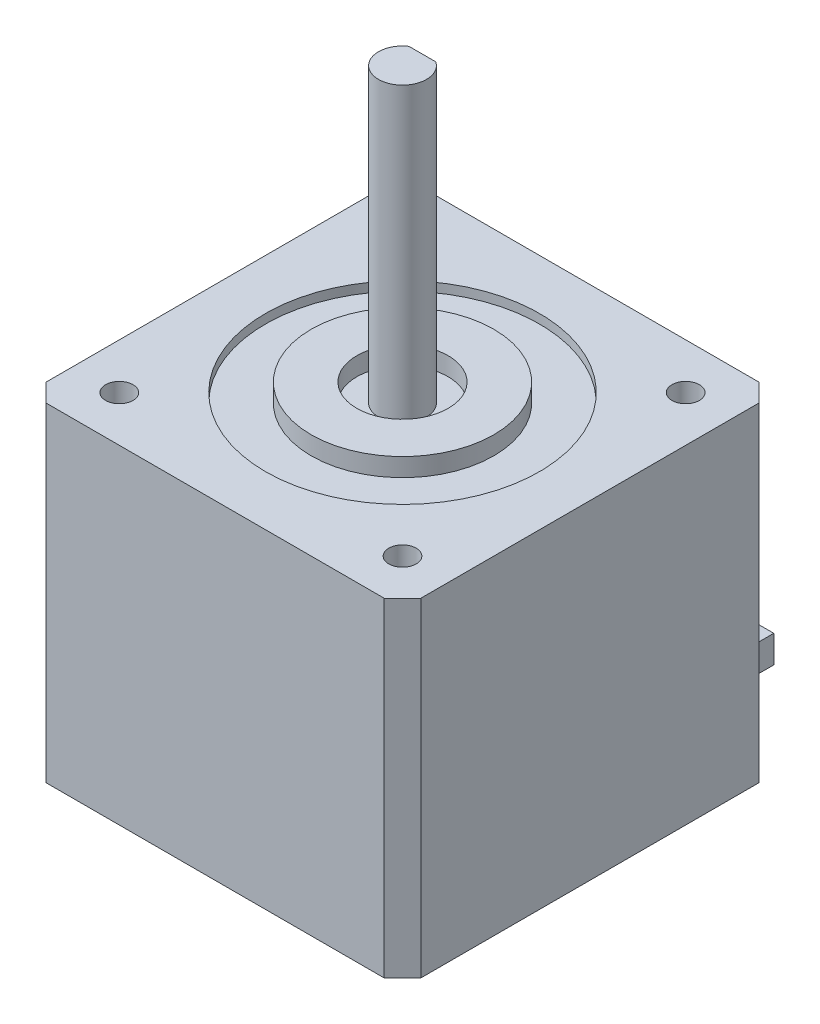
ISO-10303-21;
HEADER;
FILE_DESCRIPTION(('STEP AP214'),'2;1');
FILE_NAME('part.step','',(''),(''),'','','');
FILE_SCHEMA(('AUTOMOTIVE_DESIGN { 1 0 10303 214 1 1 1 1 }'));
ENDSEC;
DATA;
#1=APPLICATION_CONTEXT('core data for automotive mechanical design processes');
#2=APPLICATION_PROTOCOL_DEFINITION('international standard','automotive_design',2000,#1);
#3=PRODUCT_CONTEXT('',#1,'mechanical');
#4=PRODUCT('Part','Part','',(#3));
#5=PRODUCT_RELATED_PRODUCT_CATEGORY('part','',(#4));
#6=PRODUCT_DEFINITION_FORMATION('','',#4);
#7=PRODUCT_DEFINITION_CONTEXT('part definition',#1,'design');
#8=PRODUCT_DEFINITION('design','',#6,#7);
#9=PRODUCT_DEFINITION_SHAPE('','',#8);
#10=(LENGTH_UNIT() NAMED_UNIT(*) SI_UNIT(.MILLI.,.METRE.));
#11=(NAMED_UNIT(*) PLANE_ANGLE_UNIT() SI_UNIT($,.RADIAN.));
#12=(NAMED_UNIT(*) SI_UNIT($,.STERADIAN.) SOLID_ANGLE_UNIT());
#13=UNCERTAINTY_MEASURE_WITH_UNIT(LENGTH_MEASURE(1.E-05),#10,'distance_accuracy_value','');
#14=(GEOMETRIC_REPRESENTATION_CONTEXT(3) GLOBAL_UNCERTAINTY_ASSIGNED_CONTEXT((#13)) GLOBAL_UNIT_ASSIGNED_CONTEXT((#10,
#11,#12)) REPRESENTATION_CONTEXT('',''));
#15=CARTESIAN_POINT('',(0.,0.,0.));
#16=DIRECTION('',(0.,0.,1.));
#17=DIRECTION('',(1.,0.,0.));
#18=AXIS2_PLACEMENT_3D('',#15,#16,#17);
#19=CARTESIAN_POINT('',(-18.5,36.,-20.5));
#20=DIRECTION('',(0.,0.,1.));
#21=DIRECTION('',(1.,0.,0.));
#22=AXIS2_PLACEMENT_3D('',#19,#20,#21);
#23=PLANE('',#22);
#24=DIRECTION('',(0.,-1.,0.));
#25=VECTOR('',#24,1.);
#26=CARTESIAN_POINT('',(10.1415461571168,0.,-20.5));
#27=LINE('',#26,#25);
#28=CARTESIAN_POINT('',(10.1415461571168,3.,-20.5));
#29=VERTEX_POINT('',#28);
#30=CARTESIAN_POINT('',(10.1415461571168,0.,-20.5));
#31=VERTEX_POINT('',#30);
#32=EDGE_CURVE('E57',#29,#31,#27,.T.);
#33=ORIENTED_EDGE('',*,*,#32,.F.);
#34=DIRECTION('',(1.,0.,0.));
#35=VECTOR('',#34,1.);
#36=CARTESIAN_POINT('',(10.1415461571168,3.,-20.5));
#37=LINE('',#36,#35);
#38=CARTESIAN_POINT('',(-9.85845384288318,3.,-20.5));
#39=VERTEX_POINT('',#38);
#40=EDGE_CURVE('E174',#39,#29,#37,.T.);
#41=ORIENTED_EDGE('',*,*,#40,.F.);
#42=DIRECTION('',(0.,1.,0.));
#43=VECTOR('',#42,1.);
#44=CARTESIAN_POINT('',(-9.85845384288318,0.,-20.5));
#45=LINE('',#44,#43);
#46=CARTESIAN_POINT('',(-9.85845384288318,0.,-20.5));
#47=VERTEX_POINT('',#46);
#48=EDGE_CURVE('E63',#47,#39,#45,.T.);
#49=ORIENTED_EDGE('',*,*,#48,.F.);
#50=DIRECTION('',(-1.,0.,0.));
#51=VECTOR('',#50,1.);
#52=CARTESIAN_POINT('',(-18.5,0.,-20.5));
#53=LINE('',#52,#51);
#54=CARTESIAN_POINT('',(-18.5,0.,-20.5));
#55=VERTEX_POINT('',#54);
#56=EDGE_CURVE('E234',#47,#55,#53,.T.);
#57=ORIENTED_EDGE('',*,*,#56,.T.);
#58=DIRECTION('',(0.,-1.,0.));
#59=VECTOR('',#58,1.);
#60=CARTESIAN_POINT('',(-18.5,36.,-20.5));
#61=LINE('',#60,#59);
#62=CARTESIAN_POINT('',(-18.5,36.,-20.5));
#63=VERTEX_POINT('',#62);
#64=EDGE_CURVE('E50',#63,#55,#61,.T.);
#65=ORIENTED_EDGE('',*,*,#64,.F.);
#66=DIRECTION('',(-1.,0.,0.));
#67=VECTOR('',#66,1.);
#68=CARTESIAN_POINT('',(-18.5,36.,-20.5));
#69=LINE('',#68,#67);
#70=CARTESIAN_POINT('',(18.5,36.,-20.5));
#71=VERTEX_POINT('',#70);
#72=EDGE_CURVE('E237',#71,#63,#69,.T.);
#73=ORIENTED_EDGE('',*,*,#72,.F.);
#74=DIRECTION('',(0.,-1.,0.));
#75=VECTOR('',#74,1.);
#76=CARTESIAN_POINT('',(18.5,36.,-20.5));
#77=LINE('',#76,#75);
#78=CARTESIAN_POINT('',(18.5,0.,-20.5));
#79=VERTEX_POINT('',#78);
#80=EDGE_CURVE('E255',#71,#79,#77,.T.);
#81=ORIENTED_EDGE('',*,*,#80,.T.);
#82=EDGE_CURVE('E256',#79,#31,#53,.T.);
#83=ORIENTED_EDGE('',*,*,#82,.T.);
#84=EDGE_LOOP('',(#33,#41,#49,#57,#65,#73,#81,#83));
#85=FACE_BOUND('',#84,.T.);
#86=ADVANCED_FACE('F43',(#85),#23,.F.);
#87=CARTESIAN_POINT('',(0.,35.,0.));
#88=DIRECTION('',(0.,1.,0.));
#89=DIRECTION('',(0.,0.,1.));
#90=AXIS2_PLACEMENT_3D('',#87,#88,#89);
#91=PLANE('',#90);
#92=CARTESIAN_POINT('',(0.,35.,0.));
#93=DIRECTION('',(0.,1.,0.));
#94=DIRECTION('',(0.,0.,1.));
#95=AXIS2_PLACEMENT_3D('',#92,#93,#94);
#96=CIRCLE('',#95,5.);
#97=CARTESIAN_POINT('',(0.,35.,5.));
#98=VERTEX_POINT('',#97);
#99=EDGE_CURVE('E11',#98,#98,#96,.F.);
#100=ORIENTED_EDGE('',*,*,#99,.F.);
#101=EDGE_LOOP('',(#100));
#102=FACE_BOUND('',#101,.T.);
#103=DIRECTION('',(-1.,0.,0.));
#104=VECTOR('',#103,1.);
#105=CARTESIAN_POINT('',(-1.47098416147173,35.,-2.17535911633604));
#106=LINE('',#105,#104);
#107=CARTESIAN_POINT('',(1.47098416147173,35.,-2.17535911633604));
#108=VERTEX_POINT('',#107);
#109=CARTESIAN_POINT('',(-1.47098416147173,35.,-2.17535911633604));
#110=VERTEX_POINT('',#109);
#111=EDGE_CURVE('E211',#108,#110,#106,.T.);
#112=ORIENTED_EDGE('',*,*,#111,.F.);
#113=CARTESIAN_POINT('',(0.,35.,0.));
#114=DIRECTION('',(0.,1.,0.));
#115=DIRECTION('',(0.,0.,1.));
#116=AXIS2_PLACEMENT_3D('',#113,#114,#115);
#117=CIRCLE('',#116,2.62602012336673);
#118=EDGE_CURVE('E206',#110,#108,#117,.T.);
#119=ORIENTED_EDGE('',*,*,#118,.F.);
#120=EDGE_LOOP('',(#112,#119));
#121=FACE_BOUND('',#120,.T.);
#122=ADVANCED_FACE('F338',(#102,#121),#91,.T.);
#123=CARTESIAN_POINT('',(0.,35.,0.));
#124=DIRECTION('',(0.,1.,0.));
#125=DIRECTION('',(0.,0.,1.));
#126=AXIS2_PLACEMENT_3D('',#123,#124,#125);
#127=CIRCLE('',#126,15.);
#128=CARTESIAN_POINT('',(0.,35.,15.));
#129=VERTEX_POINT('',#128);
#130=EDGE_CURVE('E231',#129,#129,#127,.T.);
#131=ORIENTED_EDGE('',*,*,#130,.T.);
#132=EDGE_LOOP('',(#131));
#133=FACE_BOUND('',#132,.T.);
#134=CARTESIAN_POINT('',(0.,35.,0.));
#135=DIRECTION('',(0.,1.,0.));
#136=DIRECTION('',(0.,0.,1.));
#137=AXIS2_PLACEMENT_3D('',#134,#135,#136);
#138=CIRCLE('',#137,10.);
#139=CARTESIAN_POINT('',(0.,35.,10.));
#140=VERTEX_POINT('',#139);
#141=EDGE_CURVE('E224',#140,#140,#138,.T.);
#142=ORIENTED_EDGE('',*,*,#141,.F.);
#143=EDGE_LOOP('',(#142));
#144=FACE_BOUND('',#143,.T.);
#145=ADVANCED_FACE('F343',(#133,#144),#91,.T.);
#146=CARTESIAN_POINT('',(-20.5,36.,-18.5));
#147=DIRECTION('',(0.707106781186547,0.,0.707106781186548));
#148=DIRECTION('',(0.707106781186548,0.,-0.707106781186547));
#149=AXIS2_PLACEMENT_3D('',#146,#147,#148);
#150=PLANE('',#149);
#151=DIRECTION('',(-0.707106781186548,0.,0.707106781186547));
#152=VECTOR('',#151,1.);
#153=CARTESIAN_POINT('',(-20.5,0.,-18.5));
#154=LINE('',#153,#152);
#155=CARTESIAN_POINT('',(-20.5,0.,-18.5));
#156=VERTEX_POINT('',#155);
#157=EDGE_CURVE('E258',#55,#156,#154,.T.);
#158=ORIENTED_EDGE('',*,*,#157,.T.);
#159=DIRECTION('',(0.,-1.,0.));
#160=VECTOR('',#159,1.);
#161=CARTESIAN_POINT('',(-20.5,36.,-18.5));
#162=LINE('',#161,#160);
#163=CARTESIAN_POINT('',(-20.5,36.,-18.5));
#164=VERTEX_POINT('',#163);
#165=EDGE_CURVE('E288',#164,#156,#162,.T.);
#166=ORIENTED_EDGE('',*,*,#165,.F.);
#167=DIRECTION('',(-0.707106781186548,0.,0.707106781186547));
#168=VECTOR('',#167,1.);
#169=CARTESIAN_POINT('',(-20.5,36.,-18.5));
#170=LINE('',#169,#168);
#171=EDGE_CURVE('E240',#63,#164,#170,.T.);
#172=ORIENTED_EDGE('',*,*,#171,.F.);
#173=ORIENTED_EDGE('',*,*,#64,.T.);
#174=EDGE_LOOP('',(#158,#166,#172,#173));
#175=FACE_BOUND('',#174,.T.);
#176=ADVANCED_FACE('F293',(#175),#150,.F.);
#177=CARTESIAN_POINT('',(-20.5,36.,18.5));
#178=DIRECTION('',(1.,0.,0.));
#179=DIRECTION('',(0.,0.,-1.));
#180=AXIS2_PLACEMENT_3D('',#177,#178,#179);
#181=PLANE('',#180);
#182=DIRECTION('',(0.,0.,1.));
#183=VECTOR('',#182,1.);
#184=CARTESIAN_POINT('',(-20.5,0.,18.5));
#185=LINE('',#184,#183);
#186=CARTESIAN_POINT('',(-20.5,0.,18.5));
#187=VERTEX_POINT('',#186);
#188=EDGE_CURVE('E260',#156,#187,#185,.T.);
#189=ORIENTED_EDGE('',*,*,#188,.T.);
#190=DIRECTION('',(0.,-1.,0.));
#191=VECTOR('',#190,1.);
#192=CARTESIAN_POINT('',(-20.5,36.,18.5));
#193=LINE('',#192,#191);
#194=CARTESIAN_POINT('',(-20.5,36.,18.5));
#195=VERTEX_POINT('',#194);
#196=EDGE_CURVE('E285',#195,#187,#193,.T.);
#197=ORIENTED_EDGE('',*,*,#196,.F.);
#198=DIRECTION('',(0.,0.,1.));
#199=VECTOR('',#198,1.);
#200=CARTESIAN_POINT('',(-20.5,36.,18.5));
#201=LINE('',#200,#199);
#202=EDGE_CURVE('E243',#164,#195,#201,.T.);
#203=ORIENTED_EDGE('',*,*,#202,.F.);
#204=ORIENTED_EDGE('',*,*,#165,.T.);
#205=EDGE_LOOP('',(#189,#197,#203,#204));
#206=FACE_BOUND('',#205,.T.);
#207=ADVANCED_FACE('F302',(#206),#181,.F.);
#208=CARTESIAN_POINT('',(-18.5,36.,20.5));
#209=DIRECTION('',(0.707106781186547,0.,-0.707106781186548));
#210=DIRECTION('',(-0.707106781186548,0.,-0.707106781186547));
#211=AXIS2_PLACEMENT_3D('',#208,#209,#210);
#212=PLANE('',#211);
#213=DIRECTION('',(0.707106781186548,0.,0.707106781186547));
#214=VECTOR('',#213,1.);
#215=CARTESIAN_POINT('',(-18.5,0.,20.5));
#216=LINE('',#215,#214);
#217=CARTESIAN_POINT('',(-18.5,0.,20.5));
#218=VERTEX_POINT('',#217);
#219=EDGE_CURVE('E262',#187,#218,#216,.T.);
#220=ORIENTED_EDGE('',*,*,#219,.T.);
#221=DIRECTION('',(0.,-1.,0.));
#222=VECTOR('',#221,1.);
#223=CARTESIAN_POINT('',(-18.5,36.,20.5));
#224=LINE('',#223,#222);
#225=CARTESIAN_POINT('',(-18.5,36.,20.5));
#226=VERTEX_POINT('',#225);
#227=EDGE_CURVE('E282',#226,#218,#224,.T.);
#228=ORIENTED_EDGE('',*,*,#227,.F.);
#229=DIRECTION('',(0.707106781186548,0.,0.707106781186547));
#230=VECTOR('',#229,1.);
#231=CARTESIAN_POINT('',(-18.5,36.,20.5));
#232=LINE('',#231,#230);
#233=EDGE_CURVE('E245',#195,#226,#232,.T.);
#234=ORIENTED_EDGE('',*,*,#233,.F.);
#235=ORIENTED_EDGE('',*,*,#196,.T.);
#236=EDGE_LOOP('',(#220,#228,#234,#235));
#237=FACE_BOUND('',#236,.T.);
#238=ADVANCED_FACE('F306',(#237),#212,.F.);
#239=CARTESIAN_POINT('',(-18.5,36.,20.5));
#240=DIRECTION('',(0.,0.,-1.));
#241=DIRECTION('',(-1.,0.,0.));
#242=AXIS2_PLACEMENT_3D('',#239,#240,#241);
#243=PLANE('',#242);
#244=DIRECTION('',(1.,0.,0.));
#245=VECTOR('',#244,1.);
#246=CARTESIAN_POINT('',(-18.5,0.,20.5));
#247=LINE('',#246,#245);
#248=CARTESIAN_POINT('',(18.5,0.,20.5));
#249=VERTEX_POINT('',#248);
#250=EDGE_CURVE('E264',#218,#249,#247,.T.);
#251=ORIENTED_EDGE('',*,*,#250,.T.);
#252=DIRECTION('',(0.,-1.,0.));
#253=VECTOR('',#252,1.);
#254=CARTESIAN_POINT('',(18.5,36.,20.5));
#255=LINE('',#254,#253);
#256=CARTESIAN_POINT('',(18.5,36.,20.5));
#257=VERTEX_POINT('',#256);
#258=EDGE_CURVE('E279',#257,#249,#255,.T.);
#259=ORIENTED_EDGE('',*,*,#258,.F.);
#260=DIRECTION('',(1.,0.,0.));
#261=VECTOR('',#260,1.);
#262=CARTESIAN_POINT('',(-18.5,36.,20.5));
#263=LINE('',#262,#261);
#264=EDGE_CURVE('E247',#226,#257,#263,.T.);
#265=ORIENTED_EDGE('',*,*,#264,.F.);
#266=ORIENTED_EDGE('',*,*,#227,.T.);
#267=EDGE_LOOP('',(#251,#259,#265,#266));
#268=FACE_BOUND('',#267,.T.);
#269=ADVANCED_FACE('F328',(#268),#243,.F.);
#270=CARTESIAN_POINT('',(18.5,36.,20.5));
#271=DIRECTION('',(-0.707106781186547,0.,-0.707106781186548));
#272=DIRECTION('',(-0.707106781186548,0.,0.707106781186547));
#273=AXIS2_PLACEMENT_3D('',#270,#271,#272);
#274=PLANE('',#273);
#275=DIRECTION('',(0.707106781186548,0.,-0.707106781186547));
#276=VECTOR('',#275,1.);
#277=CARTESIAN_POINT('',(18.5,0.,20.5));
#278=LINE('',#277,#276);
#279=CARTESIAN_POINT('',(20.5,0.,18.5));
#280=VERTEX_POINT('',#279);
#281=EDGE_CURVE('E266',#249,#280,#278,.T.);
#282=ORIENTED_EDGE('',*,*,#281,.T.);
#283=DIRECTION('',(0.,-1.,0.));
#284=VECTOR('',#283,1.);
#285=CARTESIAN_POINT('',(20.5,36.,18.5));
#286=LINE('',#285,#284);
#287=CARTESIAN_POINT('',(20.5,36.,18.5));
#288=VERTEX_POINT('',#287);
#289=EDGE_CURVE('E276',#288,#280,#286,.T.);
#290=ORIENTED_EDGE('',*,*,#289,.F.);
#291=DIRECTION('',(0.707106781186548,0.,-0.707106781186547));
#292=VECTOR('',#291,1.);
#293=CARTESIAN_POINT('',(18.5,36.,20.5));
#294=LINE('',#293,#292);
#295=EDGE_CURVE('E249',#257,#288,#294,.T.);
#296=ORIENTED_EDGE('',*,*,#295,.F.);
#297=ORIENTED_EDGE('',*,*,#258,.T.);
#298=EDGE_LOOP('',(#282,#290,#296,#297));
#299=FACE_BOUND('',#298,.T.);
#300=ADVANCED_FACE('F326',(#299),#274,.F.);
#301=CARTESIAN_POINT('',(20.5,36.,18.5));
#302=DIRECTION('',(-1.,0.,0.));
#303=DIRECTION('',(0.,0.,1.));
#304=AXIS2_PLACEMENT_3D('',#301,#302,#303);
#305=PLANE('',#304);
#306=DIRECTION('',(0.,0.,-1.));
#307=VECTOR('',#306,1.);
#308=CARTESIAN_POINT('',(20.5,0.,18.5));
#309=LINE('',#308,#307);
#310=CARTESIAN_POINT('',(20.5,0.,-18.5));
#311=VERTEX_POINT('',#310);
#312=EDGE_CURVE('E268',#280,#311,#309,.T.);
#313=ORIENTED_EDGE('',*,*,#312,.T.);
#314=DIRECTION('',(0.,-1.,0.));
#315=VECTOR('',#314,1.);
#316=CARTESIAN_POINT('',(20.5,36.,-18.5));
#317=LINE('',#316,#315);
#318=CARTESIAN_POINT('',(20.5,36.,-18.5));
#319=VERTEX_POINT('',#318);
#320=EDGE_CURVE('E273',#319,#311,#317,.T.);
#321=ORIENTED_EDGE('',*,*,#320,.F.);
#322=DIRECTION('',(0.,0.,-1.));
#323=VECTOR('',#322,1.);
#324=CARTESIAN_POINT('',(20.5,36.,18.5));
#325=LINE('',#324,#323);
#326=EDGE_CURVE('E251',#288,#319,#325,.T.);
#327=ORIENTED_EDGE('',*,*,#326,.F.);
#328=ORIENTED_EDGE('',*,*,#289,.T.);
#329=EDGE_LOOP('',(#313,#321,#327,#328));
#330=FACE_BOUND('',#329,.T.);
#331=ADVANCED_FACE('F322',(#330),#305,.F.);
#332=CARTESIAN_POINT('',(20.5,36.,-18.5));
#333=DIRECTION('',(-0.707106781186547,0.,0.707106781186547));
#334=DIRECTION('',(0.707106781186548,0.,0.707106781186548));
#335=AXIS2_PLACEMENT_3D('',#332,#333,#334);
#336=PLANE('',#335);
#337=DIRECTION('',(-0.707106781186547,0.,-0.707106781186547));
#338=VECTOR('',#337,1.);
#339=CARTESIAN_POINT('',(20.5,0.,-18.5));
#340=LINE('',#339,#338);
#341=EDGE_CURVE('E241',#311,#79,#340,.T.);
#342=ORIENTED_EDGE('',*,*,#341,.T.);
#343=ORIENTED_EDGE('',*,*,#80,.F.);
#344=DIRECTION('',(-0.707106781186547,0.,-0.707106781186547));
#345=VECTOR('',#344,1.);
#346=CARTESIAN_POINT('',(20.5,36.,-18.5));
#347=LINE('',#346,#345);
#348=EDGE_CURVE('E253',#319,#71,#347,.T.);
#349=ORIENTED_EDGE('',*,*,#348,.F.);
#350=ORIENTED_EDGE('',*,*,#320,.T.);
#351=EDGE_LOOP('',(#342,#343,#349,#350));
#352=FACE_BOUND('',#351,.T.);
#353=ADVANCED_FACE('F317',(#352),#336,.F.);
#354=CARTESIAN_POINT('',(20.5,36.,-20.5));
#355=DIRECTION('',(0.,1.,0.));
#356=DIRECTION('',(0.,0.,1.));
#357=AXIS2_PLACEMENT_3D('',#354,#355,#356);
#358=PLANE('',#357);
#359=CARTESIAN_POINT('',(15.5,36.,-15.5));
#360=DIRECTION('',(0.,1.,0.));
#361=DIRECTION('',(0.,0.,1.));
#362=AXIS2_PLACEMENT_3D('',#359,#360,#361);
#363=CIRCLE('',#362,1.5);
#364=CARTESIAN_POINT('',(15.5,36.,-14.));
#365=VERTEX_POINT('',#364);
#366=EDGE_CURVE('E177',#365,#365,#363,.T.);
#367=ORIENTED_EDGE('',*,*,#366,.F.);
#368=EDGE_LOOP('',(#367));
#369=FACE_BOUND('',#368,.T.);
#370=CARTESIAN_POINT('',(-15.5,36.,-15.5));
#371=DIRECTION('',(0.,1.,0.));
#372=DIRECTION('',(0.,0.,1.));
#373=AXIS2_PLACEMENT_3D('',#370,#371,#372);
#374=CIRCLE('',#373,1.5);
#375=CARTESIAN_POINT('',(-15.5,36.,-14.));
#376=VERTEX_POINT('',#375);
#377=EDGE_CURVE('E188',#376,#376,#374,.T.);
#378=ORIENTED_EDGE('',*,*,#377,.F.);
#379=EDGE_LOOP('',(#378));
#380=FACE_BOUND('',#379,.T.);
#381=CARTESIAN_POINT('',(-15.5,36.,15.5));
#382=DIRECTION('',(0.,1.,0.));
#383=DIRECTION('',(0.,0.,1.));
#384=AXIS2_PLACEMENT_3D('',#381,#382,#383);
#385=CIRCLE('',#384,1.5);
#386=CARTESIAN_POINT('',(-15.5,36.,17.));
#387=VERTEX_POINT('',#386);
#388=EDGE_CURVE('E194',#387,#387,#385,.T.);
#389=ORIENTED_EDGE('',*,*,#388,.F.);
#390=EDGE_LOOP('',(#389));
#391=FACE_BOUND('',#390,.T.);
#392=CARTESIAN_POINT('',(15.5,36.,15.5));
#393=DIRECTION('',(0.,1.,0.));
#394=DIRECTION('',(0.,0.,1.));
#395=AXIS2_PLACEMENT_3D('',#392,#393,#394);
#396=CIRCLE('',#395,1.5);
#397=CARTESIAN_POINT('',(15.5,36.,17.));
#398=VERTEX_POINT('',#397);
#399=EDGE_CURVE('E200',#398,#398,#396,.T.);
#400=ORIENTED_EDGE('',*,*,#399,.F.);
#401=EDGE_LOOP('',(#400));
#402=FACE_BOUND('',#401,.T.);
#403=CARTESIAN_POINT('',(0.,36.,0.));
#404=DIRECTION('',(0.,1.,0.));
#405=DIRECTION('',(0.,0.,1.));
#406=AXIS2_PLACEMENT_3D('',#403,#404,#405);
#407=CIRCLE('',#406,15.);
#408=CARTESIAN_POINT('',(0.,36.,15.));
#409=VERTEX_POINT('',#408);
#410=EDGE_CURVE('E228',#409,#409,#407,.T.);
#411=ORIENTED_EDGE('',*,*,#410,.F.);
#412=EDGE_LOOP('',(#411));
#413=FACE_BOUND('',#412,.T.);
#414=ORIENTED_EDGE('',*,*,#72,.T.);
#415=ORIENTED_EDGE('',*,*,#171,.T.);
#416=ORIENTED_EDGE('',*,*,#202,.T.);
#417=ORIENTED_EDGE('',*,*,#233,.T.);
#418=ORIENTED_EDGE('',*,*,#264,.T.);
#419=ORIENTED_EDGE('',*,*,#295,.T.);
#420=ORIENTED_EDGE('',*,*,#326,.T.);
#421=ORIENTED_EDGE('',*,*,#348,.T.);
#422=EDGE_LOOP('',(#414,#415,#416,#417,#418,#419,#420,#421));
#423=FACE_BOUND('',#422,.T.);
#424=ADVANCED_FACE('F310',(#369,#380,#391,#402,#413,#423),#358,.T.);
#425=CARTESIAN_POINT('',(20.5,0.,-20.5));
#426=DIRECTION('',(0.,1.,0.));
#427=DIRECTION('',(0.,0.,1.));
#428=AXIS2_PLACEMENT_3D('',#425,#426,#427);
#429=PLANE('',#428);
#430=ORIENTED_EDGE('',*,*,#82,.F.);
#431=ORIENTED_EDGE('',*,*,#341,.F.);
#432=ORIENTED_EDGE('',*,*,#312,.F.);
#433=ORIENTED_EDGE('',*,*,#281,.F.);
#434=ORIENTED_EDGE('',*,*,#250,.F.);
#435=ORIENTED_EDGE('',*,*,#219,.F.);
#436=ORIENTED_EDGE('',*,*,#188,.F.);
#437=ORIENTED_EDGE('',*,*,#157,.F.);
#438=ORIENTED_EDGE('',*,*,#56,.F.);
#439=DIRECTION('',(0.,0.,1.));
#440=VECTOR('',#439,1.);
#441=CARTESIAN_POINT('',(-9.85845384288318,0.,-30.5));
#442=LINE('',#441,#440);
#443=CARTESIAN_POINT('',(-9.85845384288318,0.,-30.5));
#444=VERTEX_POINT('',#443);
#445=EDGE_CURVE('E161',#444,#47,#442,.T.);
#446=ORIENTED_EDGE('',*,*,#445,.F.);
#447=DIRECTION('',(-1.,0.,0.));
#448=VECTOR('',#447,1.);
#449=CARTESIAN_POINT('',(10.1415461571168,0.,-30.5));
#450=LINE('',#449,#448);
#451=CARTESIAN_POINT('',(10.1415461571168,0.,-30.5));
#452=VERTEX_POINT('',#451);
#453=EDGE_CURVE('E154',#452,#444,#450,.T.);
#454=ORIENTED_EDGE('',*,*,#453,.F.);
#455=DIRECTION('',(0.,0.,1.));
#456=VECTOR('',#455,1.);
#457=CARTESIAN_POINT('',(10.1415461571168,0.,-30.5));
#458=LINE('',#457,#456);
#459=EDGE_CURVE('E159',#452,#31,#458,.T.);
#460=ORIENTED_EDGE('',*,*,#459,.T.);
#461=EDGE_LOOP('',(#430,#431,#432,#433,#434,#435,#436,#437,#438,#446,#454,#460));
#462=FACE_BOUND('',#461,.T.);
#463=ADVANCED_FACE('F157',(#462),#429,.F.);
#464=CARTESIAN_POINT('',(0.,35.,0.));
#465=DIRECTION('',(0.,1.,0.));
#466=DIRECTION('',(0.,0.,1.));
#467=AXIS2_PLACEMENT_3D('',#464,#465,#466);
#468=CYLINDRICAL_SURFACE('',#467,15.);
#469=ORIENTED_EDGE('',*,*,#130,.F.);
#470=EDGE_LOOP('',(#469));
#471=FACE_BOUND('',#470,.T.);
#472=ORIENTED_EDGE('',*,*,#410,.T.);
#473=EDGE_LOOP('',(#472));
#474=FACE_BOUND('',#473,.T.);
#475=ADVANCED_FACE('F358',(#471,#474),#468,.F.);
#476=CARTESIAN_POINT('',(0.,37.,0.));
#477=DIRECTION('',(0.,1.,0.));
#478=DIRECTION('',(0.,0.,1.));
#479=AXIS2_PLACEMENT_3D('',#476,#477,#478);
#480=PLANE('',#479);
#481=CARTESIAN_POINT('',(0.,37.,0.));
#482=DIRECTION('',(0.,1.,0.));
#483=DIRECTION('',(0.,0.,1.));
#484=AXIS2_PLACEMENT_3D('',#481,#482,#483);
#485=CIRCLE('',#484,10.);
#486=CARTESIAN_POINT('',(0.,37.,10.));
#487=VERTEX_POINT('',#486);
#488=EDGE_CURVE('E225',#487,#487,#485,.T.);
#489=ORIENTED_EDGE('',*,*,#488,.T.);
#490=EDGE_LOOP('',(#489));
#491=FACE_BOUND('',#490,.T.);
#492=CARTESIAN_POINT('',(0.,37.,0.));
#493=DIRECTION('',(0.,1.,0.));
#494=DIRECTION('',(0.,0.,1.));
#495=AXIS2_PLACEMENT_3D('',#492,#493,#494);
#496=CIRCLE('',#495,5.);
#497=CARTESIAN_POINT('',(0.,37.,5.));
#498=VERTEX_POINT('',#497);
#499=EDGE_CURVE('E221',#498,#498,#496,.T.);
#500=ORIENTED_EDGE('',*,*,#499,.F.);
#501=EDGE_LOOP('',(#500));
#502=FACE_BOUND('',#501,.T.);
#503=ADVANCED_FACE('F361',(#491,#502),#480,.T.);
#504=CARTESIAN_POINT('',(0.,37.,0.));
#505=DIRECTION('',(0.,-1.,0.));
#506=DIRECTION('',(0.,0.,-1.));
#507=AXIS2_PLACEMENT_3D('',#504,#505,#506);
#508=CYLINDRICAL_SURFACE('',#507,10.);
#509=ORIENTED_EDGE('',*,*,#488,.F.);
#510=EDGE_LOOP('',(#509));
#511=FACE_BOUND('',#510,.T.);
#512=ORIENTED_EDGE('',*,*,#141,.T.);
#513=EDGE_LOOP('',(#512));
#514=FACE_BOUND('',#513,.T.);
#515=ADVANCED_FACE('F356',(#511,#514),#508,.T.);
#516=CARTESIAN_POINT('',(0.,37.,0.));
#517=DIRECTION('',(0.,-1.,0.));
#518=DIRECTION('',(0.,0.,-1.));
#519=AXIS2_PLACEMENT_3D('',#516,#517,#518);
#520=CYLINDRICAL_SURFACE('',#519,5.);
#521=ORIENTED_EDGE('',*,*,#499,.T.);
#522=EDGE_LOOP('',(#521));
#523=FACE_BOUND('',#522,.T.);
#524=ORIENTED_EDGE('',*,*,#99,.T.);
#525=EDGE_LOOP('',(#524));
#526=FACE_BOUND('',#525,.T.);
#527=ADVANCED_FACE('F531',(#523,#526),#520,.F.);
#528=CARTESIAN_POINT('',(0.,67.,0.));
#529=DIRECTION('',(0.,-1.,0.));
#530=DIRECTION('',(0.,0.,-1.));
#531=AXIS2_PLACEMENT_3D('',#528,#529,#530);
#532=CYLINDRICAL_SURFACE('',#531,2.62602012336673);
#533=ORIENTED_EDGE('',*,*,#118,.T.);
#534=DIRECTION('',(0.,-1.,0.));
#535=VECTOR('',#534,1.);
#536=CARTESIAN_POINT('',(1.47098416147173,67.,-2.17535911633604));
#537=LINE('',#536,#535);
#538=CARTESIAN_POINT('',(1.47098416147173,67.,-2.17535911633604));
#539=VERTEX_POINT('',#538);
#540=EDGE_CURVE('E218',#539,#108,#537,.T.);
#541=ORIENTED_EDGE('',*,*,#540,.F.);
#542=CARTESIAN_POINT('',(0.,67.,0.));
#543=DIRECTION('',(0.,1.,0.));
#544=DIRECTION('',(0.,0.,1.));
#545=AXIS2_PLACEMENT_3D('',#542,#543,#544);
#546=CIRCLE('',#545,2.62602012336673);
#547=CARTESIAN_POINT('',(-1.47098416147173,67.,-2.17535911633604));
#548=VERTEX_POINT('',#547);
#549=EDGE_CURVE('E207',#548,#539,#546,.T.);
#550=ORIENTED_EDGE('',*,*,#549,.F.);
#551=DIRECTION('',(0.,-1.,0.));
#552=VECTOR('',#551,1.);
#553=CARTESIAN_POINT('',(-1.47098416147173,67.,-2.17535911633604));
#554=LINE('',#553,#552);
#555=EDGE_CURVE('E213',#548,#110,#554,.T.);
#556=ORIENTED_EDGE('',*,*,#555,.T.);
#557=EDGE_LOOP('',(#533,#541,#550,#556));
#558=FACE_BOUND('',#557,.T.);
#559=ADVANCED_FACE('F524',(#558),#532,.T.);
#560=CARTESIAN_POINT('',(-1.47098416147173,67.,-2.17535911633604));
#561=DIRECTION('',(0.,0.,1.));
#562=DIRECTION('',(1.,0.,0.));
#563=AXIS2_PLACEMENT_3D('',#560,#561,#562);
#564=PLANE('',#563);
#565=ORIENTED_EDGE('',*,*,#111,.T.);
#566=ORIENTED_EDGE('',*,*,#555,.F.);
#567=DIRECTION('',(-1.,0.,0.));
#568=VECTOR('',#567,1.);
#569=CARTESIAN_POINT('',(-1.47098416147173,67.,-2.17535911633604));
#570=LINE('',#569,#568);
#571=EDGE_CURVE('E210',#539,#548,#570,.T.);
#572=ORIENTED_EDGE('',*,*,#571,.F.);
#573=ORIENTED_EDGE('',*,*,#540,.T.);
#574=EDGE_LOOP('',(#565,#566,#572,#573));
#575=FACE_BOUND('',#574,.T.);
#576=ADVANCED_FACE('F515',(#575),#564,.F.);
#577=CARTESIAN_POINT('',(0.,67.,0.));
#578=DIRECTION('',(0.,1.,0.));
#579=DIRECTION('',(0.,0.,1.));
#580=AXIS2_PLACEMENT_3D('',#577,#578,#579);
#581=PLANE('',#580);
#582=ORIENTED_EDGE('',*,*,#549,.T.);
#583=ORIENTED_EDGE('',*,*,#571,.T.);
#584=EDGE_LOOP('',(#582,#583));
#585=FACE_BOUND('',#584,.T.);
#586=ADVANCED_FACE('F506',(#585),#581,.T.);
#587=CARTESIAN_POINT('',(15.5,31.,15.5));
#588=DIRECTION('',(0.,1.,0.));
#589=DIRECTION('',(0.,0.,1.));
#590=AXIS2_PLACEMENT_3D('',#587,#588,#589);
#591=CONICAL_SURFACE('',#590,1.5,1.02974425867665);
#592=CARTESIAN_POINT('',(15.5,30.0987090714587,15.5));
#593=VERTEX_POINT('',#592);
#594=VERTEX_LOOP('',#593);
#595=FACE_BOUND('',#594,.T.);
#596=CARTESIAN_POINT('',(15.5,31.,15.5));
#597=DIRECTION('',(0.,1.,0.));
#598=DIRECTION('',(0.,0.,1.));
#599=AXIS2_PLACEMENT_3D('',#596,#597,#598);
#600=CIRCLE('',#599,1.5);
#601=CARTESIAN_POINT('',(15.5,31.,17.));
#602=VERTEX_POINT('',#601);
#603=EDGE_CURVE('E203',#602,#602,#600,.T.);
#604=ORIENTED_EDGE('',*,*,#603,.T.);
#605=EDGE_LOOP('',(#604));
#606=FACE_BOUND('',#605,.T.);
#607=ADVANCED_FACE('F497',(#595,#606),#591,.F.);
#608=CARTESIAN_POINT('',(15.5,36.,15.5));
#609=DIRECTION('',(0.,1.,0.));
#610=DIRECTION('',(0.,0.,1.));
#611=AXIS2_PLACEMENT_3D('',#608,#609,#610);
#612=CYLINDRICAL_SURFACE('',#611,1.5);
#613=ORIENTED_EDGE('',*,*,#603,.F.);
#614=EDGE_LOOP('',(#613));
#615=FACE_BOUND('',#614,.T.);
#616=ORIENTED_EDGE('',*,*,#399,.T.);
#617=EDGE_LOOP('',(#616));
#618=FACE_BOUND('',#617,.T.);
#619=ADVANCED_FACE('F488',(#615,#618),#612,.F.);
#620=CARTESIAN_POINT('',(-15.5,31.,15.5));
#621=DIRECTION('',(0.,1.,0.));
#622=DIRECTION('',(0.,0.,1.));
#623=AXIS2_PLACEMENT_3D('',#620,#621,#622);
#624=CONICAL_SURFACE('',#623,1.5,1.02974425867665);
#625=CARTESIAN_POINT('',(-15.5,30.0987090714587,15.5));
#626=VERTEX_POINT('',#625);
#627=VERTEX_LOOP('',#626);
#628=FACE_BOUND('',#627,.T.);
#629=CARTESIAN_POINT('',(-15.5,31.,15.5));
#630=DIRECTION('',(0.,1.,0.));
#631=DIRECTION('',(0.,0.,1.));
#632=AXIS2_PLACEMENT_3D('',#629,#630,#631);
#633=CIRCLE('',#632,1.5);
#634=CARTESIAN_POINT('',(-15.5,31.,17.));
#635=VERTEX_POINT('',#634);
#636=EDGE_CURVE('E197',#635,#635,#633,.T.);
#637=ORIENTED_EDGE('',*,*,#636,.T.);
#638=EDGE_LOOP('',(#637));
#639=FACE_BOUND('',#638,.T.);
#640=ADVANCED_FACE('F479',(#628,#639),#624,.F.);
#641=CARTESIAN_POINT('',(-15.5,36.,15.5));
#642=DIRECTION('',(0.,1.,0.));
#643=DIRECTION('',(0.,0.,1.));
#644=AXIS2_PLACEMENT_3D('',#641,#642,#643);
#645=CYLINDRICAL_SURFACE('',#644,1.5);
#646=ORIENTED_EDGE('',*,*,#636,.F.);
#647=EDGE_LOOP('',(#646));
#648=FACE_BOUND('',#647,.T.);
#649=ORIENTED_EDGE('',*,*,#388,.T.);
#650=EDGE_LOOP('',(#649));
#651=FACE_BOUND('',#650,.T.);
#652=ADVANCED_FACE('F470',(#648,#651),#645,.F.);
#653=CARTESIAN_POINT('',(-15.5,31.,-15.5));
#654=DIRECTION('',(0.,1.,0.));
#655=DIRECTION('',(0.,0.,1.));
#656=AXIS2_PLACEMENT_3D('',#653,#654,#655);
#657=CONICAL_SURFACE('',#656,1.5,1.02974425867665);
#658=CARTESIAN_POINT('',(-15.5,30.0987090714587,-15.5));
#659=VERTEX_POINT('',#658);
#660=VERTEX_LOOP('',#659);
#661=FACE_BOUND('',#660,.T.);
#662=CARTESIAN_POINT('',(-15.5,31.,-15.5));
#663=DIRECTION('',(0.,1.,0.));
#664=DIRECTION('',(0.,0.,1.));
#665=AXIS2_PLACEMENT_3D('',#662,#663,#664);
#666=CIRCLE('',#665,1.5);
#667=CARTESIAN_POINT('',(-15.5,31.,-14.));
#668=VERTEX_POINT('',#667);
#669=EDGE_CURVE('E191',#668,#668,#666,.T.);
#670=ORIENTED_EDGE('',*,*,#669,.T.);
#671=EDGE_LOOP('',(#670));
#672=FACE_BOUND('',#671,.T.);
#673=ADVANCED_FACE('F461',(#661,#672),#657,.F.);
#674=CARTESIAN_POINT('',(-15.5,36.,-15.5));
#675=DIRECTION('',(0.,1.,0.));
#676=DIRECTION('',(0.,0.,1.));
#677=AXIS2_PLACEMENT_3D('',#674,#675,#676);
#678=CYLINDRICAL_SURFACE('',#677,1.5);
#679=ORIENTED_EDGE('',*,*,#669,.F.);
#680=EDGE_LOOP('',(#679));
#681=FACE_BOUND('',#680,.T.);
#682=ORIENTED_EDGE('',*,*,#377,.T.);
#683=EDGE_LOOP('',(#682));
#684=FACE_BOUND('',#683,.T.);
#685=ADVANCED_FACE('F452',(#681,#684),#678,.F.);
#686=CARTESIAN_POINT('',(15.5,31.,-15.5));
#687=DIRECTION('',(0.,1.,0.));
#688=DIRECTION('',(0.,0.,1.));
#689=AXIS2_PLACEMENT_3D('',#686,#687,#688);
#690=CONICAL_SURFACE('',#689,1.5,1.02974425867665);
#691=CARTESIAN_POINT('',(15.5,30.0987090714587,-15.5));
#692=VERTEX_POINT('',#691);
#693=VERTEX_LOOP('',#692);
#694=FACE_BOUND('',#693,.T.);
#695=CARTESIAN_POINT('',(15.5,31.,-15.5));
#696=DIRECTION('',(0.,1.,0.));
#697=DIRECTION('',(0.,0.,1.));
#698=AXIS2_PLACEMENT_3D('',#695,#696,#697);
#699=CIRCLE('',#698,1.5);
#700=CARTESIAN_POINT('',(15.5,31.,-14.));
#701=VERTEX_POINT('',#700);
#702=EDGE_CURVE('E180',#701,#701,#699,.T.);
#703=ORIENTED_EDGE('',*,*,#702,.T.);
#704=EDGE_LOOP('',(#703));
#705=FACE_BOUND('',#704,.T.);
#706=ADVANCED_FACE('F443',(#694,#705),#690,.F.);
#707=CARTESIAN_POINT('',(15.5,36.,-15.5));
#708=DIRECTION('',(0.,1.,0.));
#709=DIRECTION('',(0.,0.,1.));
#710=AXIS2_PLACEMENT_3D('',#707,#708,#709);
#711=CYLINDRICAL_SURFACE('',#710,1.5);
#712=ORIENTED_EDGE('',*,*,#702,.F.);
#713=EDGE_LOOP('',(#712));
#714=FACE_BOUND('',#713,.T.);
#715=ORIENTED_EDGE('',*,*,#366,.T.);
#716=EDGE_LOOP('',(#715));
#717=FACE_BOUND('',#716,.T.);
#718=ADVANCED_FACE('F404',(#714,#717),#711,.F.);
#719=CARTESIAN_POINT('',(10.1415461571168,0.,-30.5));
#720=DIRECTION('',(-1.,0.,0.));
#721=DIRECTION('',(0.,0.,1.));
#722=AXIS2_PLACEMENT_3D('',#719,#720,#721);
#723=PLANE('',#722);
#724=ORIENTED_EDGE('',*,*,#32,.T.);
#725=ORIENTED_EDGE('',*,*,#459,.F.);
#726=DIRECTION('',(0.,-1.,0.));
#727=VECTOR('',#726,1.);
#728=CARTESIAN_POINT('',(10.1415461571168,0.,-30.5));
#729=LINE('',#728,#727);
#730=CARTESIAN_POINT('',(10.1415461571168,3.,-30.5));
#731=VERTEX_POINT('',#730);
#732=EDGE_CURVE('E165',#731,#452,#729,.T.);
#733=ORIENTED_EDGE('',*,*,#732,.F.);
#734=DIRECTION('',(0.,0.,1.));
#735=VECTOR('',#734,1.);
#736=CARTESIAN_POINT('',(10.1415461571168,3.,-30.5));
#737=LINE('',#736,#735);
#738=EDGE_CURVE('E693',#731,#29,#737,.T.);
#739=ORIENTED_EDGE('',*,*,#738,.T.);
#740=EDGE_LOOP('',(#724,#725,#733,#739));
#741=FACE_BOUND('',#740,.T.);
#742=ADVANCED_FACE('F176',(#741),#723,.F.);
#743=CARTESIAN_POINT('',(-9.85845384288318,0.,-30.5));
#744=DIRECTION('',(1.,0.,0.));
#745=DIRECTION('',(0.,0.,-1.));
#746=AXIS2_PLACEMENT_3D('',#743,#744,#745);
#747=PLANE('',#746);
#748=ORIENTED_EDGE('',*,*,#48,.T.);
#749=DIRECTION('',(0.,0.,1.));
#750=VECTOR('',#749,1.);
#751=CARTESIAN_POINT('',(-9.85845384288318,3.,-30.5));
#752=LINE('',#751,#750);
#753=CARTESIAN_POINT('',(-9.85845384288318,3.,-30.5));
#754=VERTEX_POINT('',#753);
#755=EDGE_CURVE('E182',#754,#39,#752,.T.);
#756=ORIENTED_EDGE('',*,*,#755,.F.);
#757=DIRECTION('',(0.,1.,0.));
#758=VECTOR('',#757,1.);
#759=CARTESIAN_POINT('',(-9.85845384288318,0.,-30.5));
#760=LINE('',#759,#758);
#761=EDGE_CURVE('E164',#444,#754,#760,.T.);
#762=ORIENTED_EDGE('',*,*,#761,.F.);
#763=ORIENTED_EDGE('',*,*,#445,.T.);
#764=EDGE_LOOP('',(#748,#756,#762,#763));
#765=FACE_BOUND('',#764,.T.);
#766=ADVANCED_FACE('F403',(#765),#747,.F.);
#767=CARTESIAN_POINT('',(10.1415461571168,3.,-30.5));
#768=DIRECTION('',(0.,-1.,0.));
#769=DIRECTION('',(0.,0.,-1.));
#770=AXIS2_PLACEMENT_3D('',#767,#768,#769);
#771=PLANE('',#770);
#772=ORIENTED_EDGE('',*,*,#40,.T.);
#773=ORIENTED_EDGE('',*,*,#738,.F.);
#774=DIRECTION('',(1.,0.,0.));
#775=VECTOR('',#774,1.);
#776=CARTESIAN_POINT('',(10.1415461571168,3.,-30.5));
#777=LINE('',#776,#775);
#778=EDGE_CURVE('E170',#754,#731,#777,.T.);
#779=ORIENTED_EDGE('',*,*,#778,.F.);
#780=ORIENTED_EDGE('',*,*,#755,.T.);
#781=EDGE_LOOP('',(#772,#773,#779,#780));
#782=FACE_BOUND('',#781,.T.);
#783=ADVANCED_FACE('F412',(#782),#771,.F.);
#784=CARTESIAN_POINT('',(0.,0.,-30.5));
#785=DIRECTION('',(0.,0.,1.));
#786=DIRECTION('',(1.,0.,0.));
#787=AXIS2_PLACEMENT_3D('',#784,#785,#786);
#788=PLANE('',#787);
#789=ORIENTED_EDGE('',*,*,#732,.T.);
#790=ORIENTED_EDGE('',*,*,#453,.T.);
#791=ORIENTED_EDGE('',*,*,#761,.T.);
#792=ORIENTED_EDGE('',*,*,#778,.T.);
#793=EDGE_LOOP('',(#789,#790,#791,#792));
#794=FACE_BOUND('',#793,.T.);
#795=ADVANCED_FACE('F168',(#794),#788,.F.);
#796=CLOSED_SHELL('',(#86,#122,#145,#176,#207,#238,#269,#300,#331,#353,#424,#463,#475,#503,#515,
#527,#559,#576,#586,#607,#619,#640,#652,#673,#685,#706,#718,#742,#766,#783,#795));
#797=MANIFOLD_SOLID_BREP('B2',#796);
#798=ADVANCED_BREP_SHAPE_REPRESENTATION('',(#18,#797),#14);
#799=SHAPE_DEFINITION_REPRESENTATION(#9,#798);
ENDSEC;
END-ISO-10303-21;
